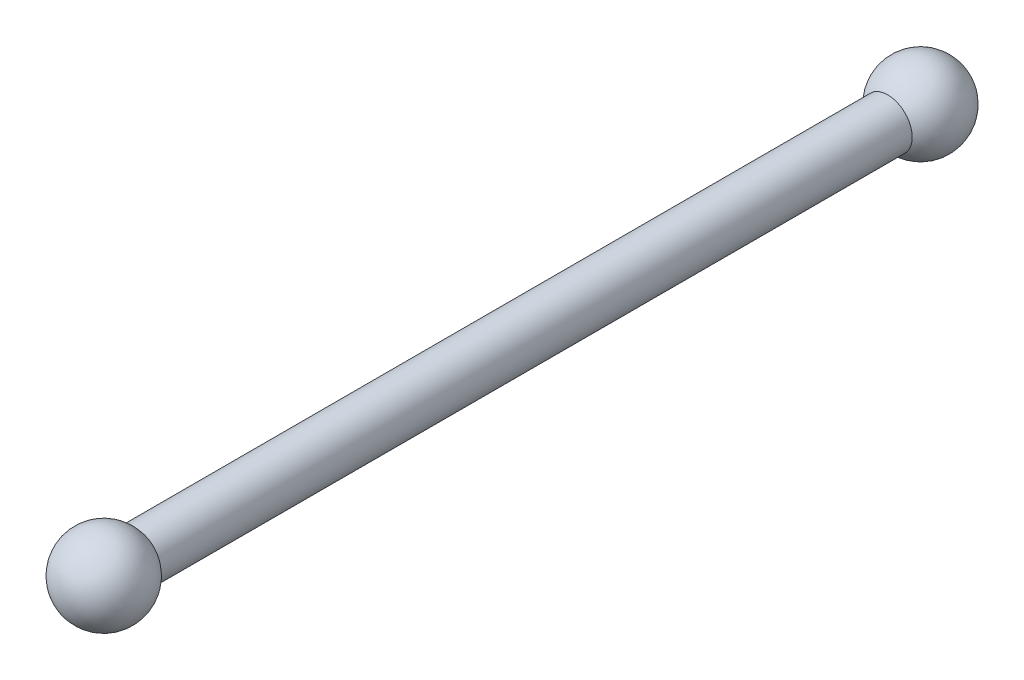
ISO-10303-21;
HEADER;
FILE_DESCRIPTION(('STEP AP214'),'2;1');
FILE_NAME('part.step','',(''),(''),'','','');
FILE_SCHEMA(('AUTOMOTIVE_DESIGN { 1 0 10303 214 1 1 1 1 }'));
ENDSEC;
DATA;
#1=APPLICATION_CONTEXT('core data for automotive mechanical design processes');
#2=APPLICATION_PROTOCOL_DEFINITION('international standard','automotive_design',2000,#1);
#3=PRODUCT_CONTEXT('',#1,'mechanical');
#4=PRODUCT('Part','Part','',(#3));
#5=PRODUCT_RELATED_PRODUCT_CATEGORY('part','',(#4));
#6=PRODUCT_DEFINITION_FORMATION('','',#4);
#7=PRODUCT_DEFINITION_CONTEXT('part definition',#1,'design');
#8=PRODUCT_DEFINITION('design','',#6,#7);
#9=PRODUCT_DEFINITION_SHAPE('','',#8);
#10=(LENGTH_UNIT() NAMED_UNIT(*) SI_UNIT(.MILLI.,.METRE.));
#11=(NAMED_UNIT(*) PLANE_ANGLE_UNIT() SI_UNIT($,.RADIAN.));
#12=(NAMED_UNIT(*) SI_UNIT($,.STERADIAN.) SOLID_ANGLE_UNIT());
#13=UNCERTAINTY_MEASURE_WITH_UNIT(LENGTH_MEASURE(1.E-05),#10,'distance_accuracy_value','');
#14=(GEOMETRIC_REPRESENTATION_CONTEXT(3) GLOBAL_UNCERTAINTY_ASSIGNED_CONTEXT((#13)) GLOBAL_UNIT_ASSIGNED_CONTEXT((#10,
#11,#12)) REPRESENTATION_CONTEXT('',''));
#15=CARTESIAN_POINT('',(0.,0.,0.));
#16=DIRECTION('',(0.,0.,1.));
#17=DIRECTION('',(1.,0.,0.));
#18=AXIS2_PLACEMENT_3D('',#15,#16,#17);
#19=CARTESIAN_POINT('',(0.,0.,-25.));
#20=DIRECTION('',(0.,0.,1.));
#21=DIRECTION('',(-1.,0.,0.));
#22=AXIS2_PLACEMENT_3D('',#19,#20,#21);
#23=SPHERICAL_SURFACE('',#22,2.5);
#24=CARTESIAN_POINT('',(0.,0.,-23.));
#25=DIRECTION('',(0.,0.,-1.));
#26=DIRECTION('',(-1.,0.,0.));
#27=AXIS2_PLACEMENT_3D('',#24,#25,#26);
#28=CIRCLE('',#27,1.5);
#29=CARTESIAN_POINT('',(-1.5,0.,-23.));
#30=VERTEX_POINT('',#29);
#31=EDGE_CURVE('E36',#30,#30,#28,.F.);
#32=ORIENTED_EDGE('',*,*,#31,.F.);
#33=EDGE_LOOP('',(#32));
#34=FACE_BOUND('',#33,.T.);
#35=ADVANCED_FACE('F32',(#34),#23,.T.);
#36=CARTESIAN_POINT('',(0.,0.,25.));
#37=DIRECTION('',(0.,0.,1.));
#38=DIRECTION('',(-1.,0.,0.));
#39=AXIS2_PLACEMENT_3D('',#36,#37,#38);
#40=SPHERICAL_SURFACE('',#39,2.5);
#41=CARTESIAN_POINT('',(0.,0.,23.));
#42=DIRECTION('',(0.,0.,1.));
#43=DIRECTION('',(1.,0.,0.));
#44=AXIS2_PLACEMENT_3D('',#41,#42,#43);
#45=CIRCLE('',#44,1.5);
#46=CARTESIAN_POINT('',(1.5,0.,23.));
#47=VERTEX_POINT('',#46);
#48=EDGE_CURVE('E10',#47,#47,#45,.F.);
#49=ORIENTED_EDGE('',*,*,#48,.F.);
#50=EDGE_LOOP('',(#49));
#51=FACE_BOUND('',#50,.T.);
#52=ADVANCED_FACE('F48',(#51),#40,.T.);
#53=CARTESIAN_POINT('',(0.,0.,25.));
#54=DIRECTION('',(0.,0.,-1.));
#55=DIRECTION('',(-1.,0.,0.));
#56=AXIS2_PLACEMENT_3D('',#53,#54,#55);
#57=CYLINDRICAL_SURFACE('',#56,1.5);
#58=ORIENTED_EDGE('',*,*,#31,.T.);
#59=EDGE_LOOP('',(#58));
#60=FACE_BOUND('',#59,.T.);
#61=ORIENTED_EDGE('',*,*,#48,.T.);
#62=EDGE_LOOP('',(#61));
#63=FACE_BOUND('',#62,.T.);
#64=ADVANCED_FACE('F34',(#60,#63),#57,.T.);
#65=CLOSED_SHELL('',(#35,#52,#64));
#66=MANIFOLD_SOLID_BREP('B2',#65);
#67=ADVANCED_BREP_SHAPE_REPRESENTATION('',(#18,#66),#14);
#68=SHAPE_DEFINITION_REPRESENTATION(#9,#67);
ENDSEC;
END-ISO-10303-21;
